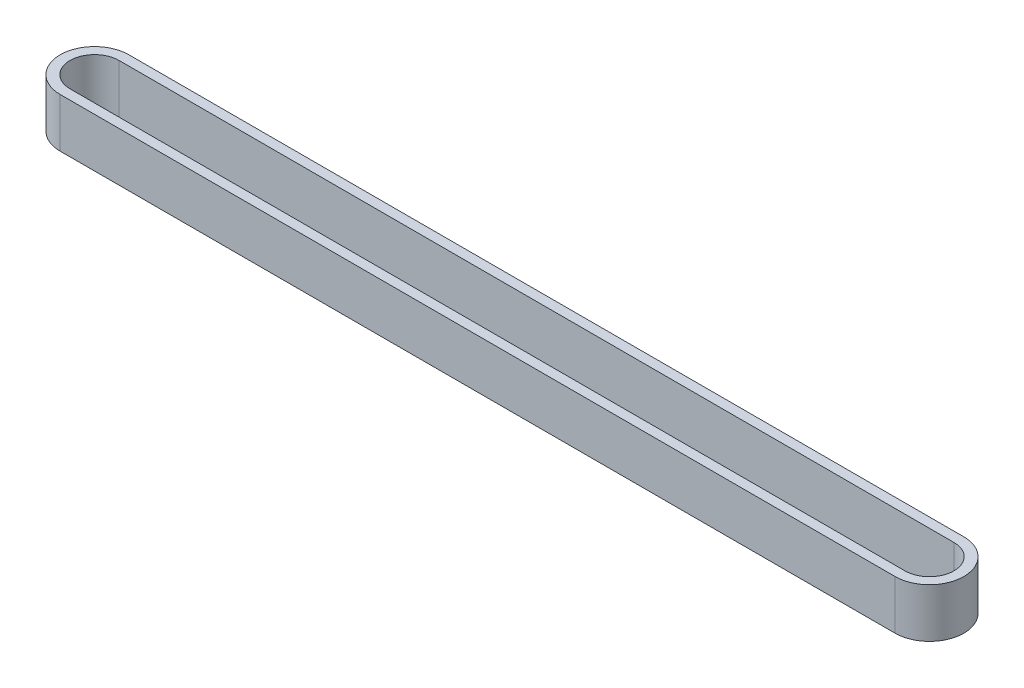
ISO-10303-21;
HEADER;
FILE_DESCRIPTION(('STEP AP214'),'2;1');
FILE_NAME('part.step','',(''),(''),'','','');
FILE_SCHEMA(('AUTOMOTIVE_DESIGN { 1 0 10303 214 1 1 1 1 }'));
ENDSEC;
DATA;
#1=APPLICATION_CONTEXT('core data for automotive mechanical design processes');
#2=APPLICATION_PROTOCOL_DEFINITION('international standard','automotive_design',2000,#1);
#3=PRODUCT_CONTEXT('',#1,'mechanical');
#4=PRODUCT('Part','Part','',(#3));
#5=PRODUCT_RELATED_PRODUCT_CATEGORY('part','',(#4));
#6=PRODUCT_DEFINITION_FORMATION('','',#4);
#7=PRODUCT_DEFINITION_CONTEXT('part definition',#1,'design');
#8=PRODUCT_DEFINITION('design','',#6,#7);
#9=PRODUCT_DEFINITION_SHAPE('','',#8);
#10=(LENGTH_UNIT() NAMED_UNIT(*) SI_UNIT(.MILLI.,.METRE.));
#11=(NAMED_UNIT(*) PLANE_ANGLE_UNIT() SI_UNIT($,.RADIAN.));
#12=(NAMED_UNIT(*) SI_UNIT($,.STERADIAN.) SOLID_ANGLE_UNIT());
#13=UNCERTAINTY_MEASURE_WITH_UNIT(LENGTH_MEASURE(1.E-05),#10,'distance_accuracy_value','');
#14=(GEOMETRIC_REPRESENTATION_CONTEXT(3) GLOBAL_UNCERTAINTY_ASSIGNED_CONTEXT((#13)) GLOBAL_UNIT_ASSIGNED_CONTEXT((#10,
#11,#12)) REPRESENTATION_CONTEXT('',''));
#15=CARTESIAN_POINT('',(0.,0.,0.));
#16=DIRECTION('',(0.,0.,1.));
#17=DIRECTION('',(1.,0.,0.));
#18=AXIS2_PLACEMENT_3D('',#15,#16,#17);
#19=CARTESIAN_POINT('',(0.,10.,0.));
#20=DIRECTION('',(0.,1.,0.));
#21=DIRECTION('',(0.,0.,1.));
#22=AXIS2_PLACEMENT_3D('',#19,#20,#21);
#23=PLANE('',#22);
#24=CARTESIAN_POINT('',(0.,10.,0.));
#25=DIRECTION('',(0.,1.,0.));
#26=DIRECTION('',(0.,0.,1.));
#27=AXIS2_PLACEMENT_3D('',#24,#25,#26);
#28=CIRCLE('',#27,7.);
#29=CARTESIAN_POINT('',(0.,10.,7.));
#30=VERTEX_POINT('',#29);
#31=CARTESIAN_POINT('',(0.,10.,-7.));
#32=VERTEX_POINT('',#31);
#33=EDGE_CURVE('E142',#30,#32,#28,.T.);
#34=ORIENTED_EDGE('',*,*,#33,.T.);
#35=DIRECTION('',(-1.,0.,0.));
#36=VECTOR('',#35,1.);
#37=CARTESIAN_POINT('',(0.,10.,-7.));
#38=LINE('',#37,#36);
#39=CARTESIAN_POINT('',(-170.,10.,-6.99999999999998));
#40=VERTEX_POINT('',#39);
#41=EDGE_CURVE('E145',#32,#40,#38,.T.);
#42=ORIENTED_EDGE('',*,*,#41,.T.);
#43=CARTESIAN_POINT('',(-170.,10.,0.));
#44=DIRECTION('',(0.,1.,0.));
#45=DIRECTION('',(0.,0.,1.));
#46=AXIS2_PLACEMENT_3D('',#43,#44,#45);
#47=CIRCLE('',#46,7.);
#48=CARTESIAN_POINT('',(-170.,10.,7.00000000000002));
#49=VERTEX_POINT('',#48);
#50=EDGE_CURVE('E148',#40,#49,#47,.T.);
#51=ORIENTED_EDGE('',*,*,#50,.T.);
#52=DIRECTION('',(1.,0.,0.));
#53=VECTOR('',#52,1.);
#54=CARTESIAN_POINT('',(0.,10.,7.));
#55=LINE('',#54,#53);
#56=EDGE_CURVE('E150',#49,#30,#55,.T.);
#57=ORIENTED_EDGE('',*,*,#56,.T.);
#58=EDGE_LOOP('',(#34,#42,#51,#57));
#59=FACE_BOUND('',#58,.T.);
#60=DIRECTION('',(-1.,0.,0.));
#61=VECTOR('',#60,1.);
#62=CARTESIAN_POINT('',(0.,10.,-5.));
#63=LINE('',#62,#61);
#64=CARTESIAN_POINT('',(0.,10.,-5.));
#65=VERTEX_POINT('',#64);
#66=CARTESIAN_POINT('',(-170.,10.,-4.99999999999998));
#67=VERTEX_POINT('',#66);
#68=EDGE_CURVE('E114',#65,#67,#63,.T.);
#69=ORIENTED_EDGE('',*,*,#68,.F.);
#70=CARTESIAN_POINT('',(0.,10.,0.));
#71=DIRECTION('',(0.,1.,0.));
#72=DIRECTION('',(0.,0.,1.));
#73=AXIS2_PLACEMENT_3D('',#70,#71,#72);
#74=CIRCLE('',#73,5.);
#75=CARTESIAN_POINT('',(0.,10.,5.));
#76=VERTEX_POINT('',#75);
#77=EDGE_CURVE('E106',#76,#65,#74,.T.);
#78=ORIENTED_EDGE('',*,*,#77,.F.);
#79=DIRECTION('',(1.,0.,0.));
#80=VECTOR('',#79,1.);
#81=CARTESIAN_POINT('',(0.,10.,5.));
#82=LINE('',#81,#80);
#83=CARTESIAN_POINT('',(-170.,10.,5.00000000000002));
#84=VERTEX_POINT('',#83);
#85=EDGE_CURVE('E128',#84,#76,#82,.T.);
#86=ORIENTED_EDGE('',*,*,#85,.F.);
#87=CARTESIAN_POINT('',(-170.,10.,0.));
#88=DIRECTION('',(0.,1.,0.));
#89=DIRECTION('',(0.,0.,1.));
#90=AXIS2_PLACEMENT_3D('',#87,#88,#89);
#91=CIRCLE('',#90,5.);
#92=EDGE_CURVE('E126',#67,#84,#91,.T.);
#93=ORIENTED_EDGE('',*,*,#92,.F.);
#94=EDGE_LOOP('',(#69,#78,#86,#93));
#95=FACE_BOUND('',#94,.T.);
#96=ADVANCED_FACE('F41',(#59,#95),#23,.T.);
#97=CARTESIAN_POINT('',(0.,0.,0.));
#98=DIRECTION('',(0.,1.,0.));
#99=DIRECTION('',(0.,0.,1.));
#100=AXIS2_PLACEMENT_3D('',#97,#98,#99);
#101=PLANE('',#100);
#102=CARTESIAN_POINT('',(0.,0.,0.));
#103=DIRECTION('',(0.,1.,0.));
#104=DIRECTION('',(0.,0.,1.));
#105=AXIS2_PLACEMENT_3D('',#102,#103,#104);
#106=CIRCLE('',#105,7.);
#107=CARTESIAN_POINT('',(0.,0.,7.));
#108=VERTEX_POINT('',#107);
#109=CARTESIAN_POINT('',(0.,0.,-7.));
#110=VERTEX_POINT('',#109);
#111=EDGE_CURVE('E122',#108,#110,#106,.T.);
#112=ORIENTED_EDGE('',*,*,#111,.F.);
#113=DIRECTION('',(1.,0.,0.));
#114=VECTOR('',#113,1.);
#115=CARTESIAN_POINT('',(0.,0.,7.));
#116=LINE('',#115,#114);
#117=CARTESIAN_POINT('',(-170.,0.,7.00000000000002));
#118=VERTEX_POINT('',#117);
#119=EDGE_CURVE('E146',#118,#108,#116,.T.);
#120=ORIENTED_EDGE('',*,*,#119,.F.);
#121=CARTESIAN_POINT('',(-170.,0.,0.));
#122=DIRECTION('',(0.,1.,0.));
#123=DIRECTION('',(0.,0.,1.));
#124=AXIS2_PLACEMENT_3D('',#121,#122,#123);
#125=CIRCLE('',#124,7.);
#126=CARTESIAN_POINT('',(-170.,0.,-6.99999999999998));
#127=VERTEX_POINT('',#126);
#128=EDGE_CURVE('E157',#127,#118,#125,.T.);
#129=ORIENTED_EDGE('',*,*,#128,.F.);
#130=DIRECTION('',(-1.,0.,0.));
#131=VECTOR('',#130,1.);
#132=CARTESIAN_POINT('',(0.,0.,-7.));
#133=LINE('',#132,#131);
#134=EDGE_CURVE('E155',#110,#127,#133,.T.);
#135=ORIENTED_EDGE('',*,*,#134,.F.);
#136=EDGE_LOOP('',(#112,#120,#129,#135));
#137=FACE_BOUND('',#136,.T.);
#138=CARTESIAN_POINT('',(0.,0.,0.));
#139=DIRECTION('',(0.,1.,0.));
#140=DIRECTION('',(0.,0.,1.));
#141=AXIS2_PLACEMENT_3D('',#138,#139,#140);
#142=CIRCLE('',#141,5.);
#143=CARTESIAN_POINT('',(0.,0.,5.));
#144=VERTEX_POINT('',#143);
#145=CARTESIAN_POINT('',(0.,0.,-5.));
#146=VERTEX_POINT('',#145);
#147=EDGE_CURVE('E64',#144,#146,#142,.T.);
#148=ORIENTED_EDGE('',*,*,#147,.T.);
#149=DIRECTION('',(-1.,0.,0.));
#150=VECTOR('',#149,1.);
#151=CARTESIAN_POINT('',(0.,0.,-5.));
#152=LINE('',#151,#150);
#153=CARTESIAN_POINT('',(-170.,0.,-4.99999999999998));
#154=VERTEX_POINT('',#153);
#155=EDGE_CURVE('E121',#146,#154,#152,.T.);
#156=ORIENTED_EDGE('',*,*,#155,.T.);
#157=CARTESIAN_POINT('',(-170.,0.,0.));
#158=DIRECTION('',(0.,1.,0.));
#159=DIRECTION('',(0.,0.,1.));
#160=AXIS2_PLACEMENT_3D('',#157,#158,#159);
#161=CIRCLE('',#160,5.);
#162=CARTESIAN_POINT('',(-170.,0.,5.00000000000002));
#163=VERTEX_POINT('',#162);
#164=EDGE_CURVE('E134',#154,#163,#161,.T.);
#165=ORIENTED_EDGE('',*,*,#164,.T.);
#166=DIRECTION('',(1.,0.,0.));
#167=VECTOR('',#166,1.);
#168=CARTESIAN_POINT('',(0.,0.,5.));
#169=LINE('',#168,#167);
#170=EDGE_CURVE('E115',#163,#144,#169,.T.);
#171=ORIENTED_EDGE('',*,*,#170,.T.);
#172=EDGE_LOOP('',(#148,#156,#165,#171));
#173=FACE_BOUND('',#172,.T.);
#174=ADVANCED_FACE('F175',(#137,#173),#101,.F.);
#175=CARTESIAN_POINT('',(0.,10.,0.));
#176=DIRECTION('',(0.,-1.,0.));
#177=DIRECTION('',(0.,0.,-1.));
#178=AXIS2_PLACEMENT_3D('',#175,#176,#177);
#179=CYLINDRICAL_SURFACE('',#178,7.);
#180=ORIENTED_EDGE('',*,*,#111,.T.);
#181=DIRECTION('',(0.,-1.,0.));
#182=VECTOR('',#181,1.);
#183=CARTESIAN_POINT('',(0.,10.,-7.));
#184=LINE('',#183,#182);
#185=EDGE_CURVE('E11',#32,#110,#184,.T.);
#186=ORIENTED_EDGE('',*,*,#185,.F.);
#187=ORIENTED_EDGE('',*,*,#33,.F.);
#188=DIRECTION('',(0.,-1.,0.));
#189=VECTOR('',#188,1.);
#190=CARTESIAN_POINT('',(0.,10.,7.));
#191=LINE('',#190,#189);
#192=EDGE_CURVE('E152',#30,#108,#191,.T.);
#193=ORIENTED_EDGE('',*,*,#192,.T.);
#194=EDGE_LOOP('',(#180,#186,#187,#193));
#195=FACE_BOUND('',#194,.T.);
#196=ADVANCED_FACE('F43',(#195),#179,.T.);
#197=CARTESIAN_POINT('',(0.,10.,-7.));
#198=DIRECTION('',(0.,0.,1.));
#199=DIRECTION('',(1.,0.,0.));
#200=AXIS2_PLACEMENT_3D('',#197,#198,#199);
#201=PLANE('',#200);
#202=ORIENTED_EDGE('',*,*,#134,.T.);
#203=DIRECTION('',(0.,-1.,0.));
#204=VECTOR('',#203,1.);
#205=CARTESIAN_POINT('',(-170.,10.,-6.99999999999998));
#206=LINE('',#205,#204);
#207=EDGE_CURVE('E49',#40,#127,#206,.T.);
#208=ORIENTED_EDGE('',*,*,#207,.F.);
#209=ORIENTED_EDGE('',*,*,#41,.F.);
#210=ORIENTED_EDGE('',*,*,#185,.T.);
#211=EDGE_LOOP('',(#202,#208,#209,#210));
#212=FACE_BOUND('',#211,.T.);
#213=ADVANCED_FACE('F185',(#212),#201,.F.);
#214=CARTESIAN_POINT('',(-170.,10.,0.));
#215=DIRECTION('',(0.,-1.,0.));
#216=DIRECTION('',(0.,0.,-1.));
#217=AXIS2_PLACEMENT_3D('',#214,#215,#216);
#218=CYLINDRICAL_SURFACE('',#217,7.);
#219=ORIENTED_EDGE('',*,*,#128,.T.);
#220=DIRECTION('',(0.,-1.,0.));
#221=VECTOR('',#220,1.);
#222=CARTESIAN_POINT('',(-170.,10.,7.00000000000002));
#223=LINE('',#222,#221);
#224=EDGE_CURVE('E162',#49,#118,#223,.T.);
#225=ORIENTED_EDGE('',*,*,#224,.F.);
#226=ORIENTED_EDGE('',*,*,#50,.F.);
#227=ORIENTED_EDGE('',*,*,#207,.T.);
#228=EDGE_LOOP('',(#219,#225,#226,#227));
#229=FACE_BOUND('',#228,.T.);
#230=ADVANCED_FACE('F169',(#229),#218,.T.);
#231=CARTESIAN_POINT('',(0.,10.,7.));
#232=DIRECTION('',(0.,0.,-1.));
#233=DIRECTION('',(-1.,0.,0.));
#234=AXIS2_PLACEMENT_3D('',#231,#232,#233);
#235=PLANE('',#234);
#236=ORIENTED_EDGE('',*,*,#119,.T.);
#237=ORIENTED_EDGE('',*,*,#192,.F.);
#238=ORIENTED_EDGE('',*,*,#56,.F.);
#239=ORIENTED_EDGE('',*,*,#224,.T.);
#240=EDGE_LOOP('',(#236,#237,#238,#239));
#241=FACE_BOUND('',#240,.T.);
#242=ADVANCED_FACE('F179',(#241),#235,.F.);
#243=CARTESIAN_POINT('',(0.,10.,0.));
#244=DIRECTION('',(0.,-1.,0.));
#245=DIRECTION('',(0.,0.,-1.));
#246=AXIS2_PLACEMENT_3D('',#243,#244,#245);
#247=CYLINDRICAL_SURFACE('',#246,5.);
#248=ORIENTED_EDGE('',*,*,#147,.F.);
#249=DIRECTION('',(0.,-1.,0.));
#250=VECTOR('',#249,1.);
#251=CARTESIAN_POINT('',(0.,10.,5.));
#252=LINE('',#251,#250);
#253=EDGE_CURVE('E110',#76,#144,#252,.T.);
#254=ORIENTED_EDGE('',*,*,#253,.F.);
#255=ORIENTED_EDGE('',*,*,#77,.T.);
#256=DIRECTION('',(0.,-1.,0.));
#257=VECTOR('',#256,1.);
#258=CARTESIAN_POINT('',(0.,10.,-5.));
#259=LINE('',#258,#257);
#260=EDGE_CURVE('E109',#65,#146,#259,.T.);
#261=ORIENTED_EDGE('',*,*,#260,.T.);
#262=EDGE_LOOP('',(#248,#254,#255,#261));
#263=FACE_BOUND('',#262,.T.);
#264=ADVANCED_FACE('F108',(#263),#247,.F.);
#265=CARTESIAN_POINT('',(0.,10.,-5.));
#266=DIRECTION('',(0.,0.,1.));
#267=DIRECTION('',(1.,0.,0.));
#268=AXIS2_PLACEMENT_3D('',#265,#266,#267);
#269=PLANE('',#268);
#270=ORIENTED_EDGE('',*,*,#155,.F.);
#271=ORIENTED_EDGE('',*,*,#260,.F.);
#272=ORIENTED_EDGE('',*,*,#68,.T.);
#273=DIRECTION('',(0.,-1.,0.));
#274=VECTOR('',#273,1.);
#275=CARTESIAN_POINT('',(-170.,10.,-4.99999999999998));
#276=LINE('',#275,#274);
#277=EDGE_CURVE('E123',#67,#154,#276,.T.);
#278=ORIENTED_EDGE('',*,*,#277,.T.);
#279=EDGE_LOOP('',(#270,#271,#272,#278));
#280=FACE_BOUND('',#279,.T.);
#281=ADVANCED_FACE('F118',(#280),#269,.T.);
#282=CARTESIAN_POINT('',(-170.,10.,0.));
#283=DIRECTION('',(0.,-1.,0.));
#284=DIRECTION('',(0.,0.,-1.));
#285=AXIS2_PLACEMENT_3D('',#282,#283,#284);
#286=CYLINDRICAL_SURFACE('',#285,5.);
#287=ORIENTED_EDGE('',*,*,#164,.F.);
#288=ORIENTED_EDGE('',*,*,#277,.F.);
#289=ORIENTED_EDGE('',*,*,#92,.T.);
#290=DIRECTION('',(0.,-1.,0.));
#291=VECTOR('',#290,1.);
#292=CARTESIAN_POINT('',(-170.,10.,5.00000000000002));
#293=LINE('',#292,#291);
#294=EDGE_CURVE('E56',#84,#163,#293,.T.);
#295=ORIENTED_EDGE('',*,*,#294,.T.);
#296=EDGE_LOOP('',(#287,#288,#289,#295));
#297=FACE_BOUND('',#296,.T.);
#298=ADVANCED_FACE('F208',(#297),#286,.F.);
#299=CARTESIAN_POINT('',(0.,10.,5.));
#300=DIRECTION('',(0.,0.,-1.));
#301=DIRECTION('',(-1.,0.,0.));
#302=AXIS2_PLACEMENT_3D('',#299,#300,#301);
#303=PLANE('',#302);
#304=ORIENTED_EDGE('',*,*,#170,.F.);
#305=ORIENTED_EDGE('',*,*,#294,.F.);
#306=ORIENTED_EDGE('',*,*,#85,.T.);
#307=ORIENTED_EDGE('',*,*,#253,.T.);
#308=EDGE_LOOP('',(#304,#305,#306,#307));
#309=FACE_BOUND('',#308,.T.);
#310=ADVANCED_FACE('F212',(#309),#303,.T.);
#311=CLOSED_SHELL('',(#96,#174,#196,#213,#230,#242,#264,#281,#298,#310));
#312=MANIFOLD_SOLID_BREP('B2',#311);
#313=ADVANCED_BREP_SHAPE_REPRESENTATION('',(#18,#312),#14);
#314=SHAPE_DEFINITION_REPRESENTATION(#9,#313);
ENDSEC;
END-ISO-10303-21;
